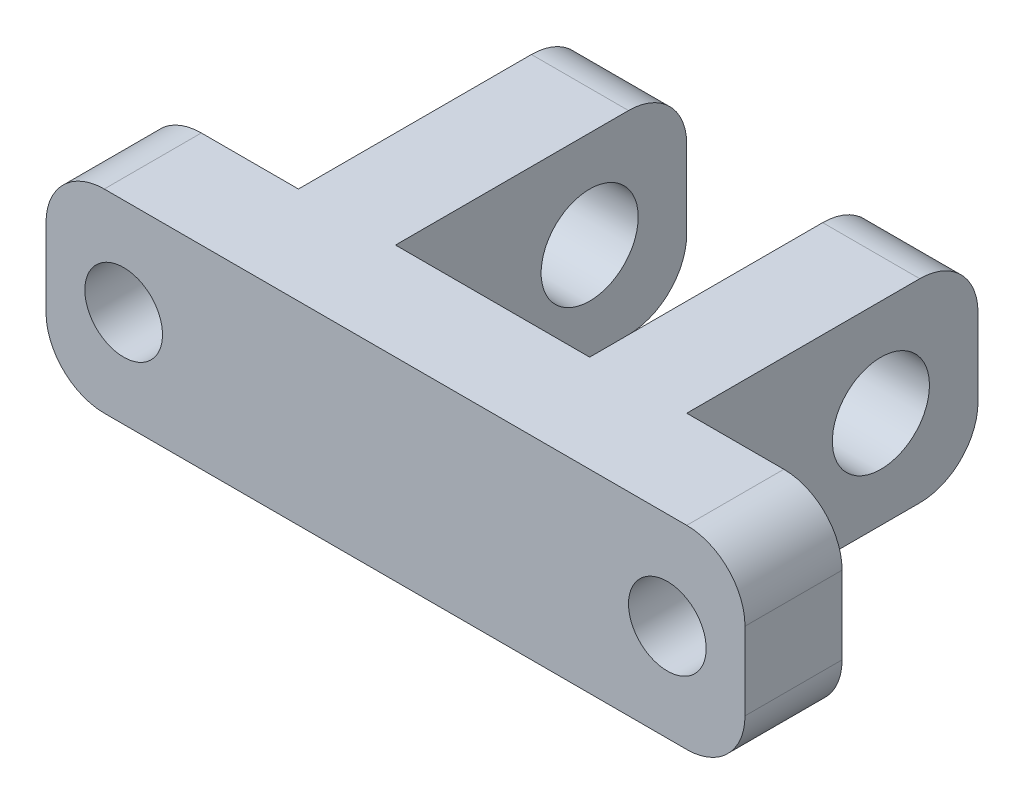
ISO-10303-21;
HEADER;
FILE_DESCRIPTION(('STEP AP214'),'2;1');
FILE_NAME('part.step','',(''),(''),'','','');
FILE_SCHEMA(('AUTOMOTIVE_DESIGN { 1 0 10303 214 1 1 1 1 }'));
ENDSEC;
DATA;
#1=APPLICATION_CONTEXT('core data for automotive mechanical design processes');
#2=APPLICATION_PROTOCOL_DEFINITION('international standard','automotive_design',2000,#1);
#3=PRODUCT_CONTEXT('',#1,'mechanical');
#4=PRODUCT('Part','Part','',(#3));
#5=PRODUCT_RELATED_PRODUCT_CATEGORY('part','',(#4));
#6=PRODUCT_DEFINITION_FORMATION('','',#4);
#7=PRODUCT_DEFINITION_CONTEXT('part definition',#1,'design');
#8=PRODUCT_DEFINITION('design','',#6,#7);
#9=PRODUCT_DEFINITION_SHAPE('','',#8);
#10=(LENGTH_UNIT() NAMED_UNIT(*) SI_UNIT(.MILLI.,.METRE.));
#11=(NAMED_UNIT(*) PLANE_ANGLE_UNIT() SI_UNIT($,.RADIAN.));
#12=(NAMED_UNIT(*) SI_UNIT($,.STERADIAN.) SOLID_ANGLE_UNIT());
#13=UNCERTAINTY_MEASURE_WITH_UNIT(LENGTH_MEASURE(1.E-05),#10,'distance_accuracy_value','');
#14=(GEOMETRIC_REPRESENTATION_CONTEXT(3) GLOBAL_UNCERTAINTY_ASSIGNED_CONTEXT((#13)) GLOBAL_UNIT_ASSIGNED_CONTEXT((#10,
#11,#12)) REPRESENTATION_CONTEXT('',''));
#15=CARTESIAN_POINT('',(0.,0.,0.));
#16=DIRECTION('',(0.,0.,1.));
#17=DIRECTION('',(1.,0.,0.));
#18=AXIS2_PLACEMENT_3D('',#15,#16,#17);
#19=CARTESIAN_POINT('',(18.,10.,-4.99999999999999));
#20=DIRECTION('',(0.,0.,1.));
#21=DIRECTION('',(1.,0.,0.));
#22=AXIS2_PLACEMENT_3D('',#19,#20,#21);
#23=PLANE('',#22);
#24=CARTESIAN_POINT('',(14.,5.,-4.99999999999999));
#25=DIRECTION('',(0.,0.,-1.));
#26=DIRECTION('',(-1.,0.,0.));
#27=AXIS2_PLACEMENT_3D('',#24,#25,#26);
#28=CIRCLE('',#27,2.);
#29=CARTESIAN_POINT('',(12.,5.,-4.99999999999999));
#30=VERTEX_POINT('',#29);
#31=EDGE_CURVE('E444',#30,#30,#28,.T.);
#32=ORIENTED_EDGE('',*,*,#31,.F.);
#33=EDGE_LOOP('',(#32));
#34=FACE_BOUND('',#33,.T.);
#35=DIRECTION('',(-1.,0.,0.));
#36=VECTOR('',#35,1.);
#37=CARTESIAN_POINT('',(18.,10.,-4.99999999999999));
#38=LINE('',#37,#36);
#39=CARTESIAN_POINT('',(15.,10.,-4.99999999999999));
#40=VERTEX_POINT('',#39);
#41=CARTESIAN_POINT('',(10.,10.,-4.99999999999999));
#42=VERTEX_POINT('',#41);
#43=EDGE_CURVE('E174',#40,#42,#38,.T.);
#44=ORIENTED_EDGE('',*,*,#43,.F.);
#45=CARTESIAN_POINT('',(15.,7.,-4.99999999999999));
#46=DIRECTION('',(0.,0.,1.));
#47=DIRECTION('',(1.,0.,0.));
#48=AXIS2_PLACEMENT_3D('',#45,#46,#47);
#49=CIRCLE('',#48,3.);
#50=CARTESIAN_POINT('',(18.,7.,-4.99999999999999));
#51=VERTEX_POINT('',#50);
#52=EDGE_CURVE('E59',#40,#51,#49,.F.);
#53=ORIENTED_EDGE('',*,*,#52,.T.);
#54=DIRECTION('',(0.,-1.,0.));
#55=VECTOR('',#54,1.);
#56=CARTESIAN_POINT('',(18.,10.,-4.99999999999999));
#57=LINE('',#56,#55);
#58=CARTESIAN_POINT('',(18.,3.,-4.99999999999999));
#59=VERTEX_POINT('',#58);
#60=EDGE_CURVE('E274',#51,#59,#57,.T.);
#61=ORIENTED_EDGE('',*,*,#60,.T.);
#62=CARTESIAN_POINT('',(15.,3.,-4.99999999999999));
#63=DIRECTION('',(0.,0.,1.));
#64=DIRECTION('',(1.,0.,0.));
#65=AXIS2_PLACEMENT_3D('',#62,#63,#64);
#66=CIRCLE('',#65,3.);
#67=CARTESIAN_POINT('',(15.,0.,-4.99999999999999));
#68=VERTEX_POINT('',#67);
#69=EDGE_CURVE('E51',#59,#68,#66,.F.);
#70=ORIENTED_EDGE('',*,*,#69,.T.);
#71=DIRECTION('',(-1.,0.,0.));
#72=VECTOR('',#71,1.);
#73=CARTESIAN_POINT('',(18.,0.,-4.99999999999999));
#74=LINE('',#73,#72);
#75=CARTESIAN_POINT('',(10.,0.,-4.99999999999999));
#76=VERTEX_POINT('',#75);
#77=EDGE_CURVE('E197',#68,#76,#74,.T.);
#78=ORIENTED_EDGE('',*,*,#77,.T.);
#79=DIRECTION('',(0.,-1.,0.));
#80=VECTOR('',#79,1.);
#81=CARTESIAN_POINT('',(10.,10.,-4.99999999999999));
#82=LINE('',#81,#80);
#83=EDGE_CURVE('E191',#42,#76,#82,.T.);
#84=ORIENTED_EDGE('',*,*,#83,.F.);
#85=EDGE_LOOP('',(#44,#53,#61,#70,#78,#84));
#86=FACE_BOUND('',#85,.T.);
#87=ADVANCED_FACE('F36',(#34,#86),#23,.F.);
#88=CARTESIAN_POINT('',(10.,10.,-4.99999999999999));
#89=DIRECTION('',(-1.,0.,0.));
#90=DIRECTION('',(0.,0.,1.));
#91=AXIS2_PLACEMENT_3D('',#88,#89,#90);
#92=PLANE('',#91);
#93=CARTESIAN_POINT('',(10.,5.,-15.));
#94=DIRECTION('',(1.,0.,0.));
#95=DIRECTION('',(0.,0.,-1.));
#96=AXIS2_PLACEMENT_3D('',#93,#94,#95);
#97=CIRCLE('',#96,2.5);
#98=CARTESIAN_POINT('',(9.99999999999999,5.,-17.5));
#99=VERTEX_POINT('',#98);
#100=EDGE_CURVE('E211',#99,#99,#97,.T.);
#101=ORIENTED_EDGE('',*,*,#100,.F.);
#102=EDGE_LOOP('',(#101));
#103=FACE_BOUND('',#102,.T.);
#104=DIRECTION('',(0.,-1.,0.));
#105=VECTOR('',#104,1.);
#106=CARTESIAN_POINT('',(10.,10.,-20.));
#107=LINE('',#106,#105);
#108=CARTESIAN_POINT('',(10.,7.,-20.));
#109=VERTEX_POINT('',#108);
#110=CARTESIAN_POINT('',(10.,3.,-20.));
#111=VERTEX_POINT('',#110);
#112=EDGE_CURVE('E199',#109,#111,#107,.T.);
#113=ORIENTED_EDGE('',*,*,#112,.F.);
#114=CARTESIAN_POINT('',(10.,7.,-17.));
#115=DIRECTION('',(-1.,0.,0.));
#116=DIRECTION('',(0.,0.,1.));
#117=AXIS2_PLACEMENT_3D('',#114,#115,#116);
#118=CIRCLE('',#117,3.);
#119=CARTESIAN_POINT('',(10.,10.,-17.));
#120=VERTEX_POINT('',#119);
#121=EDGE_CURVE('E193',#109,#120,#118,.F.);
#122=ORIENTED_EDGE('',*,*,#121,.T.);
#123=DIRECTION('',(0.,0.,-1.));
#124=VECTOR('',#123,1.);
#125=CARTESIAN_POINT('',(10.,10.,-4.99999999999999));
#126=LINE('',#125,#124);
#127=EDGE_CURVE('E178',#42,#120,#126,.T.);
#128=ORIENTED_EDGE('',*,*,#127,.F.);
#129=ORIENTED_EDGE('',*,*,#83,.T.);
#130=DIRECTION('',(0.,0.,-1.));
#131=VECTOR('',#130,1.);
#132=CARTESIAN_POINT('',(10.,0.,-4.99999999999999));
#133=LINE('',#132,#131);
#134=CARTESIAN_POINT('',(10.,0.,-17.));
#135=VERTEX_POINT('',#134);
#136=EDGE_CURVE('E333',#76,#135,#133,.T.);
#137=ORIENTED_EDGE('',*,*,#136,.T.);
#138=CARTESIAN_POINT('',(10.,3.,-17.));
#139=DIRECTION('',(-1.,0.,0.));
#140=DIRECTION('',(0.,0.,1.));
#141=AXIS2_PLACEMENT_3D('',#138,#139,#140);
#142=CIRCLE('',#141,3.);
#143=EDGE_CURVE('E229',#135,#111,#142,.F.);
#144=ORIENTED_EDGE('',*,*,#143,.T.);
#145=EDGE_LOOP('',(#113,#122,#128,#129,#137,#144));
#146=FACE_BOUND('',#145,.T.);
#147=ADVANCED_FACE('F189',(#103,#146),#92,.F.);
#148=CARTESIAN_POINT('',(10.,10.,-20.));
#149=DIRECTION('',(0.,0.,1.));
#150=DIRECTION('',(1.,0.,0.));
#151=AXIS2_PLACEMENT_3D('',#148,#149,#150);
#152=PLANE('',#151);
#153=DIRECTION('',(0.,-1.,0.));
#154=VECTOR('',#153,1.);
#155=CARTESIAN_POINT('',(5.,10.,-20.));
#156=LINE('',#155,#154);
#157=CARTESIAN_POINT('',(5.,7.,-20.));
#158=VERTEX_POINT('',#157);
#159=CARTESIAN_POINT('',(5.,3.,-20.));
#160=VERTEX_POINT('',#159);
#161=EDGE_CURVE('E204',#158,#160,#156,.T.);
#162=ORIENTED_EDGE('',*,*,#161,.F.);
#163=DIRECTION('',(-1.,0.,0.));
#164=VECTOR('',#163,1.);
#165=CARTESIAN_POINT('',(10.,7.,-20.));
#166=LINE('',#165,#164);
#167=EDGE_CURVE('E227',#158,#109,#166,.F.);
#168=ORIENTED_EDGE('',*,*,#167,.T.);
#169=ORIENTED_EDGE('',*,*,#112,.T.);
#170=DIRECTION('',(-1.,0.,0.));
#171=VECTOR('',#170,1.);
#172=CARTESIAN_POINT('',(5.,3.,-20.));
#173=LINE('',#172,#171);
#174=EDGE_CURVE('E224',#111,#160,#173,.T.);
#175=ORIENTED_EDGE('',*,*,#174,.T.);
#176=EDGE_LOOP('',(#162,#168,#169,#175));
#177=FACE_BOUND('',#176,.T.);
#178=ADVANCED_FACE('F315',(#177),#152,.F.);
#179=CARTESIAN_POINT('',(5.,10.,-20.));
#180=DIRECTION('',(1.,0.,0.));
#181=DIRECTION('',(0.,0.,-1.));
#182=AXIS2_PLACEMENT_3D('',#179,#180,#181);
#183=PLANE('',#182);
#184=CARTESIAN_POINT('',(5.,5.,-15.));
#185=DIRECTION('',(1.,0.,0.));
#186=DIRECTION('',(0.,0.,-1.));
#187=AXIS2_PLACEMENT_3D('',#184,#185,#186);
#188=CIRCLE('',#187,2.5);
#189=CARTESIAN_POINT('',(5.,5.,-17.5));
#190=VERTEX_POINT('',#189);
#191=EDGE_CURVE('E334',#190,#190,#188,.T.);
#192=ORIENTED_EDGE('',*,*,#191,.T.);
#193=EDGE_LOOP('',(#192));
#194=FACE_BOUND('',#193,.T.);
#195=DIRECTION('',(0.,0.,1.));
#196=VECTOR('',#195,1.);
#197=CARTESIAN_POINT('',(5.,10.,-20.));
#198=LINE('',#197,#196);
#199=CARTESIAN_POINT('',(5.,10.,-17.));
#200=VERTEX_POINT('',#199);
#201=CARTESIAN_POINT('',(5.,10.,-5.));
#202=VERTEX_POINT('',#201);
#203=EDGE_CURVE('E194',#200,#202,#198,.T.);
#204=ORIENTED_EDGE('',*,*,#203,.F.);
#205=CARTESIAN_POINT('',(5.,7.,-17.));
#206=DIRECTION('',(1.,0.,0.));
#207=DIRECTION('',(0.,0.,-1.));
#208=AXIS2_PLACEMENT_3D('',#205,#206,#207);
#209=CIRCLE('',#208,3.);
#210=EDGE_CURVE('E222',#200,#158,#209,.F.);
#211=ORIENTED_EDGE('',*,*,#210,.T.);
#212=ORIENTED_EDGE('',*,*,#161,.T.);
#213=CARTESIAN_POINT('',(5.,3.,-17.));
#214=DIRECTION('',(1.,0.,0.));
#215=DIRECTION('',(0.,0.,-1.));
#216=AXIS2_PLACEMENT_3D('',#213,#214,#215);
#217=CIRCLE('',#216,3.);
#218=CARTESIAN_POINT('',(5.,0.,-17.));
#219=VERTEX_POINT('',#218);
#220=EDGE_CURVE('E220',#160,#219,#217,.F.);
#221=ORIENTED_EDGE('',*,*,#220,.T.);
#222=DIRECTION('',(0.,0.,1.));
#223=VECTOR('',#222,1.);
#224=CARTESIAN_POINT('',(5.,0.,-20.));
#225=LINE('',#224,#223);
#226=CARTESIAN_POINT('',(5.,0.,-5.));
#227=VERTEX_POINT('',#226);
#228=EDGE_CURVE('E336',#219,#227,#225,.T.);
#229=ORIENTED_EDGE('',*,*,#228,.T.);
#230=DIRECTION('',(0.,-1.,0.));
#231=VECTOR('',#230,1.);
#232=CARTESIAN_POINT('',(5.,10.,-5.));
#233=LINE('',#232,#231);
#234=EDGE_CURVE('E305',#202,#227,#233,.T.);
#235=ORIENTED_EDGE('',*,*,#234,.F.);
#236=EDGE_LOOP('',(#204,#211,#212,#221,#229,#235));
#237=FACE_BOUND('',#236,.T.);
#238=ADVANCED_FACE('F311',(#194,#237),#183,.F.);
#239=CARTESIAN_POINT('',(5.,10.,-5.));
#240=DIRECTION('',(0.,0.,1.));
#241=DIRECTION('',(1.,0.,0.));
#242=AXIS2_PLACEMENT_3D('',#239,#240,#241);
#243=PLANE('',#242);
#244=DIRECTION('',(-1.,0.,0.));
#245=VECTOR('',#244,1.);
#246=CARTESIAN_POINT('',(5.,0.,-5.));
#247=LINE('',#246,#245);
#248=CARTESIAN_POINT('',(-5.,0.,-5.));
#249=VERTEX_POINT('',#248);
#250=EDGE_CURVE('E338',#227,#249,#247,.T.);
#251=ORIENTED_EDGE('',*,*,#250,.T.);
#252=DIRECTION('',(0.,-1.,0.));
#253=VECTOR('',#252,1.);
#254=CARTESIAN_POINT('',(-5.,10.,-5.));
#255=LINE('',#254,#253);
#256=CARTESIAN_POINT('',(-5.,10.,-5.));
#257=VERTEX_POINT('',#256);
#258=EDGE_CURVE('E302',#257,#249,#255,.T.);
#259=ORIENTED_EDGE('',*,*,#258,.F.);
#260=DIRECTION('',(-1.,0.,0.));
#261=VECTOR('',#260,1.);
#262=CARTESIAN_POINT('',(5.,10.,-5.));
#263=LINE('',#262,#261);
#264=EDGE_CURVE('E321',#202,#257,#263,.T.);
#265=ORIENTED_EDGE('',*,*,#264,.F.);
#266=ORIENTED_EDGE('',*,*,#234,.T.);
#267=EDGE_LOOP('',(#251,#259,#265,#266));
#268=FACE_BOUND('',#267,.T.);
#269=ADVANCED_FACE('F386',(#268),#243,.F.);
#270=CARTESIAN_POINT('',(-5.,10.,-5.));
#271=DIRECTION('',(-1.,0.,0.));
#272=DIRECTION('',(0.,0.,1.));
#273=AXIS2_PLACEMENT_3D('',#270,#271,#272);
#274=PLANE('',#273);
#275=CARTESIAN_POINT('',(-5.,5.,-15.));
#276=DIRECTION('',(-1.,0.,0.));
#277=DIRECTION('',(0.,0.,1.));
#278=AXIS2_PLACEMENT_3D('',#275,#276,#277);
#279=CIRCLE('',#278,2.5);
#280=CARTESIAN_POINT('',(-5.,5.,-17.5));
#281=VERTEX_POINT('',#280);
#282=EDGE_CURVE('E210',#281,#281,#279,.T.);
#283=ORIENTED_EDGE('',*,*,#282,.T.);
#284=EDGE_LOOP('',(#283));
#285=FACE_BOUND('',#284,.T.);
#286=DIRECTION('',(0.,0.,-1.));
#287=VECTOR('',#286,1.);
#288=CARTESIAN_POINT('',(-5.,0.,-5.));
#289=LINE('',#288,#287);
#290=CARTESIAN_POINT('',(-5.,0.,-17.));
#291=VERTEX_POINT('',#290);
#292=EDGE_CURVE('E340',#249,#291,#289,.T.);
#293=ORIENTED_EDGE('',*,*,#292,.T.);
#294=CARTESIAN_POINT('',(-5.,3.,-17.));
#295=DIRECTION('',(-1.,0.,0.));
#296=DIRECTION('',(0.,0.,1.));
#297=AXIS2_PLACEMENT_3D('',#294,#295,#296);
#298=CIRCLE('',#297,3.);
#299=CARTESIAN_POINT('',(-5.,3.,-20.));
#300=VERTEX_POINT('',#299);
#301=EDGE_CURVE('E251',#291,#300,#298,.F.);
#302=ORIENTED_EDGE('',*,*,#301,.T.);
#303=DIRECTION('',(0.,-1.,0.));
#304=VECTOR('',#303,1.);
#305=CARTESIAN_POINT('',(-5.,10.,-20.));
#306=LINE('',#305,#304);
#307=CARTESIAN_POINT('',(-5.,7.,-20.));
#308=VERTEX_POINT('',#307);
#309=EDGE_CURVE('E299',#308,#300,#306,.T.);
#310=ORIENTED_EDGE('',*,*,#309,.F.);
#311=CARTESIAN_POINT('',(-5.,7.,-17.));
#312=DIRECTION('',(-1.,0.,0.));
#313=DIRECTION('',(0.,0.,1.));
#314=AXIS2_PLACEMENT_3D('',#311,#312,#313);
#315=CIRCLE('',#314,3.);
#316=CARTESIAN_POINT('',(-5.,10.,-17.));
#317=VERTEX_POINT('',#316);
#318=EDGE_CURVE('E249',#308,#317,#315,.F.);
#319=ORIENTED_EDGE('',*,*,#318,.T.);
#320=DIRECTION('',(0.,0.,-1.));
#321=VECTOR('',#320,1.);
#322=CARTESIAN_POINT('',(-5.,10.,-5.));
#323=LINE('',#322,#321);
#324=EDGE_CURVE('E323',#257,#317,#323,.T.);
#325=ORIENTED_EDGE('',*,*,#324,.F.);
#326=ORIENTED_EDGE('',*,*,#258,.T.);
#327=EDGE_LOOP('',(#293,#302,#310,#319,#325,#326));
#328=FACE_BOUND('',#327,.T.);
#329=ADVANCED_FACE('F390',(#285,#328),#274,.F.);
#330=CARTESIAN_POINT('',(-5.,10.,-20.));
#331=DIRECTION('',(0.,0.,1.));
#332=DIRECTION('',(1.,0.,0.));
#333=AXIS2_PLACEMENT_3D('',#330,#331,#332);
#334=PLANE('',#333);
#335=ORIENTED_EDGE('',*,*,#309,.T.);
#336=DIRECTION('',(-1.,0.,0.));
#337=VECTOR('',#336,1.);
#338=CARTESIAN_POINT('',(-10.,3.,-20.));
#339=LINE('',#338,#337);
#340=CARTESIAN_POINT('',(-10.,3.,-20.));
#341=VERTEX_POINT('',#340);
#342=EDGE_CURVE('E242',#300,#341,#339,.T.);
#343=ORIENTED_EDGE('',*,*,#342,.T.);
#344=DIRECTION('',(0.,-1.,0.));
#345=VECTOR('',#344,1.);
#346=CARTESIAN_POINT('',(-10.,10.,-20.));
#347=LINE('',#346,#345);
#348=CARTESIAN_POINT('',(-10.,7.,-20.));
#349=VERTEX_POINT('',#348);
#350=EDGE_CURVE('E296',#349,#341,#347,.T.);
#351=ORIENTED_EDGE('',*,*,#350,.F.);
#352=DIRECTION('',(-1.,0.,0.));
#353=VECTOR('',#352,1.);
#354=CARTESIAN_POINT('',(-5.,7.,-20.));
#355=LINE('',#354,#353);
#356=EDGE_CURVE('E240',#349,#308,#355,.F.);
#357=ORIENTED_EDGE('',*,*,#356,.T.);
#358=EDGE_LOOP('',(#335,#343,#351,#357));
#359=FACE_BOUND('',#358,.T.);
#360=ADVANCED_FACE('F394',(#359),#334,.F.);
#361=CARTESIAN_POINT('',(-10.,10.,-20.));
#362=DIRECTION('',(1.,0.,0.));
#363=DIRECTION('',(0.,0.,-1.));
#364=AXIS2_PLACEMENT_3D('',#361,#362,#363);
#365=PLANE('',#364);
#366=CARTESIAN_POINT('',(-10.,5.,-15.));
#367=DIRECTION('',(1.,0.,0.));
#368=DIRECTION('',(0.,0.,-1.));
#369=AXIS2_PLACEMENT_3D('',#366,#367,#368);
#370=CIRCLE('',#369,2.5);
#371=CARTESIAN_POINT('',(-10.,5.,-17.5));
#372=VERTEX_POINT('',#371);
#373=EDGE_CURVE('E208',#372,#372,#370,.T.);
#374=ORIENTED_EDGE('',*,*,#373,.T.);
#375=EDGE_LOOP('',(#374));
#376=FACE_BOUND('',#375,.T.);
#377=ORIENTED_EDGE('',*,*,#350,.T.);
#378=CARTESIAN_POINT('',(-10.,3.,-17.));
#379=DIRECTION('',(1.,0.,0.));
#380=DIRECTION('',(0.,0.,-1.));
#381=AXIS2_PLACEMENT_3D('',#378,#379,#380);
#382=CIRCLE('',#381,3.);
#383=CARTESIAN_POINT('',(-10.,0.,-17.));
#384=VERTEX_POINT('',#383);
#385=EDGE_CURVE('E247',#341,#384,#382,.F.);
#386=ORIENTED_EDGE('',*,*,#385,.T.);
#387=DIRECTION('',(0.,0.,1.));
#388=VECTOR('',#387,1.);
#389=CARTESIAN_POINT('',(-10.,0.,-20.));
#390=LINE('',#389,#388);
#391=CARTESIAN_POINT('',(-10.,0.,-5.));
#392=VERTEX_POINT('',#391);
#393=EDGE_CURVE('E343',#384,#392,#390,.T.);
#394=ORIENTED_EDGE('',*,*,#393,.T.);
#395=DIRECTION('',(0.,-1.,0.));
#396=VECTOR('',#395,1.);
#397=CARTESIAN_POINT('',(-10.,10.,-5.));
#398=LINE('',#397,#396);
#399=CARTESIAN_POINT('',(-10.,10.,-5.));
#400=VERTEX_POINT('',#399);
#401=EDGE_CURVE('E293',#400,#392,#398,.T.);
#402=ORIENTED_EDGE('',*,*,#401,.F.);
#403=DIRECTION('',(0.,0.,1.));
#404=VECTOR('',#403,1.);
#405=CARTESIAN_POINT('',(-10.,10.,-20.));
#406=LINE('',#405,#404);
#407=CARTESIAN_POINT('',(-10.,10.,-17.));
#408=VERTEX_POINT('',#407);
#409=EDGE_CURVE('E328',#408,#400,#406,.T.);
#410=ORIENTED_EDGE('',*,*,#409,.F.);
#411=CARTESIAN_POINT('',(-10.,7.,-17.));
#412=DIRECTION('',(1.,0.,0.));
#413=DIRECTION('',(0.,0.,-1.));
#414=AXIS2_PLACEMENT_3D('',#411,#412,#413);
#415=CIRCLE('',#414,3.);
#416=EDGE_CURVE('E245',#408,#349,#415,.F.);
#417=ORIENTED_EDGE('',*,*,#416,.T.);
#418=EDGE_LOOP('',(#377,#386,#394,#402,#410,#417));
#419=FACE_BOUND('',#418,.T.);
#420=ADVANCED_FACE('F398',(#376,#419),#365,.F.);
#421=CARTESIAN_POINT('',(-10.,10.,-5.));
#422=DIRECTION('',(0.,0.,1.));
#423=DIRECTION('',(1.,0.,0.));
#424=AXIS2_PLACEMENT_3D('',#421,#422,#423);
#425=PLANE('',#424);
#426=CARTESIAN_POINT('',(-14.,5.,-5.));
#427=DIRECTION('',(0.,0.,-1.));
#428=DIRECTION('',(-1.,0.,0.));
#429=AXIS2_PLACEMENT_3D('',#426,#427,#428);
#430=CIRCLE('',#429,2.);
#431=CARTESIAN_POINT('',(-16.,5.,-5.));
#432=VERTEX_POINT('',#431);
#433=EDGE_CURVE('E439',#432,#432,#430,.T.);
#434=ORIENTED_EDGE('',*,*,#433,.F.);
#435=EDGE_LOOP('',(#434));
#436=FACE_BOUND('',#435,.T.);
#437=DIRECTION('',(-1.,0.,0.));
#438=VECTOR('',#437,1.);
#439=CARTESIAN_POINT('',(-10.,0.,-5.));
#440=LINE('',#439,#438);
#441=CARTESIAN_POINT('',(-15.,0.,-5.));
#442=VERTEX_POINT('',#441);
#443=EDGE_CURVE('E344',#392,#442,#440,.T.);
#444=ORIENTED_EDGE('',*,*,#443,.T.);
#445=CARTESIAN_POINT('',(-15.,3.,-5.));
#446=DIRECTION('',(0.,0.,1.));
#447=DIRECTION('',(1.,0.,0.));
#448=AXIS2_PLACEMENT_3D('',#445,#446,#447);
#449=CIRCLE('',#448,3.);
#450=CARTESIAN_POINT('',(-18.,3.,-5.));
#451=VERTEX_POINT('',#450);
#452=EDGE_CURVE('E268',#442,#451,#449,.F.);
#453=ORIENTED_EDGE('',*,*,#452,.T.);
#454=DIRECTION('',(0.,-1.,0.));
#455=VECTOR('',#454,1.);
#456=CARTESIAN_POINT('',(-18.,10.,-5.));
#457=LINE('',#456,#455);
#458=CARTESIAN_POINT('',(-18.,7.,-5.));
#459=VERTEX_POINT('',#458);
#460=EDGE_CURVE('E290',#459,#451,#457,.T.);
#461=ORIENTED_EDGE('',*,*,#460,.F.);
#462=CARTESIAN_POINT('',(-15.,7.,-5.));
#463=DIRECTION('',(0.,0.,1.));
#464=DIRECTION('',(1.,0.,0.));
#465=AXIS2_PLACEMENT_3D('',#462,#463,#464);
#466=CIRCLE('',#465,3.);
#467=CARTESIAN_POINT('',(-15.,10.,-5.));
#468=VERTEX_POINT('',#467);
#469=EDGE_CURVE('E266',#459,#468,#466,.F.);
#470=ORIENTED_EDGE('',*,*,#469,.T.);
#471=DIRECTION('',(-1.,0.,0.));
#472=VECTOR('',#471,1.);
#473=CARTESIAN_POINT('',(-10.,10.,-5.));
#474=LINE('',#473,#472);
#475=EDGE_CURVE('E283',#400,#468,#474,.T.);
#476=ORIENTED_EDGE('',*,*,#475,.F.);
#477=ORIENTED_EDGE('',*,*,#401,.T.);
#478=EDGE_LOOP('',(#444,#453,#461,#470,#476,#477));
#479=FACE_BOUND('',#478,.T.);
#480=ADVANCED_FACE('F402',(#436,#479),#425,.F.);
#481=CARTESIAN_POINT('',(-18.,10.,-5.));
#482=DIRECTION('',(1.,0.,0.));
#483=DIRECTION('',(0.,0.,-1.));
#484=AXIS2_PLACEMENT_3D('',#481,#482,#483);
#485=PLANE('',#484);
#486=ORIENTED_EDGE('',*,*,#460,.T.);
#487=DIRECTION('',(0.,0.,1.));
#488=VECTOR('',#487,1.);
#489=CARTESIAN_POINT('',(-18.,3.,0.));
#490=LINE('',#489,#488);
#491=CARTESIAN_POINT('',(-18.,3.,0.));
#492=VERTEX_POINT('',#491);
#493=EDGE_CURVE('E255',#451,#492,#490,.T.);
#494=ORIENTED_EDGE('',*,*,#493,.T.);
#495=DIRECTION('',(0.,-1.,0.));
#496=VECTOR('',#495,1.);
#497=CARTESIAN_POINT('',(-18.,10.,0.));
#498=LINE('',#497,#496);
#499=CARTESIAN_POINT('',(-18.,7.,0.));
#500=VERTEX_POINT('',#499);
#501=EDGE_CURVE('E281',#500,#492,#498,.T.);
#502=ORIENTED_EDGE('',*,*,#501,.F.);
#503=DIRECTION('',(0.,0.,1.));
#504=VECTOR('',#503,1.);
#505=CARTESIAN_POINT('',(-18.,7.,-5.));
#506=LINE('',#505,#504);
#507=EDGE_CURVE('E253',#500,#459,#506,.F.);
#508=ORIENTED_EDGE('',*,*,#507,.T.);
#509=EDGE_LOOP('',(#486,#494,#502,#508));
#510=FACE_BOUND('',#509,.T.);
#511=ADVANCED_FACE('F406',(#510),#485,.F.);
#512=CARTESIAN_POINT('',(-18.,10.,0.));
#513=DIRECTION('',(0.,0.,-1.));
#514=DIRECTION('',(-1.,0.,0.));
#515=AXIS2_PLACEMENT_3D('',#512,#513,#514);
#516=PLANE('',#515);
#517=CARTESIAN_POINT('',(-14.,5.,0.));
#518=DIRECTION('',(0.,0.,-1.));
#519=DIRECTION('',(-1.,0.,0.));
#520=AXIS2_PLACEMENT_3D('',#517,#518,#519);
#521=CIRCLE('',#520,2.);
#522=CARTESIAN_POINT('',(-16.,5.,0.));
#523=VERTEX_POINT('',#522);
#524=EDGE_CURVE('E436',#523,#523,#521,.T.);
#525=ORIENTED_EDGE('',*,*,#524,.T.);
#526=EDGE_LOOP('',(#525));
#527=FACE_BOUND('',#526,.T.);
#528=CARTESIAN_POINT('',(14.,5.,0.));
#529=DIRECTION('',(0.,0.,-1.));
#530=DIRECTION('',(-1.,0.,0.));
#531=AXIS2_PLACEMENT_3D('',#528,#529,#530);
#532=CIRCLE('',#531,2.);
#533=CARTESIAN_POINT('',(12.,5.,0.));
#534=VERTEX_POINT('',#533);
#535=EDGE_CURVE('E440',#534,#534,#532,.T.);
#536=ORIENTED_EDGE('',*,*,#535,.T.);
#537=EDGE_LOOP('',(#536));
#538=FACE_BOUND('',#537,.T.);
#539=ORIENTED_EDGE('',*,*,#501,.T.);
#540=CARTESIAN_POINT('',(-15.,3.,0.));
#541=DIRECTION('',(0.,0.,-1.));
#542=DIRECTION('',(-1.,0.,0.));
#543=AXIS2_PLACEMENT_3D('',#540,#541,#542);
#544=CIRCLE('',#543,3.);
#545=CARTESIAN_POINT('',(-15.,0.,0.));
#546=VERTEX_POINT('',#545);
#547=EDGE_CURVE('E264',#492,#546,#544,.F.);
#548=ORIENTED_EDGE('',*,*,#547,.T.);
#549=DIRECTION('',(1.,0.,0.));
#550=VECTOR('',#549,1.);
#551=CARTESIAN_POINT('',(-18.,0.,0.));
#552=LINE('',#551,#550);
#553=CARTESIAN_POINT('',(15.,0.,0.));
#554=VERTEX_POINT('',#553);
#555=EDGE_CURVE('E184',#546,#554,#552,.T.);
#556=ORIENTED_EDGE('',*,*,#555,.T.);
#557=CARTESIAN_POINT('',(15.,3.,0.));
#558=DIRECTION('',(0.,0.,-1.));
#559=DIRECTION('',(-1.,0.,0.));
#560=AXIS2_PLACEMENT_3D('',#557,#558,#559);
#561=CIRCLE('',#560,3.);
#562=CARTESIAN_POINT('',(18.,3.,0.));
#563=VERTEX_POINT('',#562);
#564=EDGE_CURVE('E258',#554,#563,#561,.F.);
#565=ORIENTED_EDGE('',*,*,#564,.T.);
#566=DIRECTION('',(0.,-1.,0.));
#567=VECTOR('',#566,1.);
#568=CARTESIAN_POINT('',(18.,10.,0.));
#569=LINE('',#568,#567);
#570=CARTESIAN_POINT('',(18.,7.,0.));
#571=VERTEX_POINT('',#570);
#572=EDGE_CURVE('E277',#571,#563,#569,.T.);
#573=ORIENTED_EDGE('',*,*,#572,.F.);
#574=CARTESIAN_POINT('',(15.,7.,0.));
#575=DIRECTION('',(0.,0.,-1.));
#576=DIRECTION('',(-1.,0.,0.));
#577=AXIS2_PLACEMENT_3D('',#574,#575,#576);
#578=CIRCLE('',#577,3.);
#579=CARTESIAN_POINT('',(15.,10.,0.));
#580=VERTEX_POINT('',#579);
#581=EDGE_CURVE('E260',#571,#580,#578,.F.);
#582=ORIENTED_EDGE('',*,*,#581,.T.);
#583=DIRECTION('',(1.,0.,0.));
#584=VECTOR('',#583,1.);
#585=CARTESIAN_POINT('',(-18.,10.,0.));
#586=LINE('',#585,#584);
#587=CARTESIAN_POINT('',(-15.,10.,0.));
#588=VERTEX_POINT('',#587);
#589=EDGE_CURVE('E279',#588,#580,#586,.T.);
#590=ORIENTED_EDGE('',*,*,#589,.F.);
#591=CARTESIAN_POINT('',(-15.,7.,0.));
#592=DIRECTION('',(0.,0.,-1.));
#593=DIRECTION('',(-1.,0.,0.));
#594=AXIS2_PLACEMENT_3D('',#591,#592,#593);
#595=CIRCLE('',#594,3.);
#596=EDGE_CURVE('E262',#588,#500,#595,.F.);
#597=ORIENTED_EDGE('',*,*,#596,.T.);
#598=EDGE_LOOP('',(#539,#548,#556,#565,#573,#582,#590,#597));
#599=FACE_BOUND('',#598,.T.);
#600=ADVANCED_FACE('F352',(#527,#538,#599),#516,.F.);
#601=CARTESIAN_POINT('',(18.,10.,0.));
#602=DIRECTION('',(-1.,0.,0.));
#603=DIRECTION('',(0.,0.,1.));
#604=AXIS2_PLACEMENT_3D('',#601,#602,#603);
#605=PLANE('',#604);
#606=ORIENTED_EDGE('',*,*,#60,.F.);
#607=DIRECTION('',(0.,0.,-1.));
#608=VECTOR('',#607,1.);
#609=CARTESIAN_POINT('',(18.,7.,0.));
#610=LINE('',#609,#608);
#611=EDGE_CURVE('E11',#51,#571,#610,.F.);
#612=ORIENTED_EDGE('',*,*,#611,.T.);
#613=ORIENTED_EDGE('',*,*,#572,.T.);
#614=DIRECTION('',(0.,0.,-1.));
#615=VECTOR('',#614,1.);
#616=CARTESIAN_POINT('',(18.,3.,-4.99999999999999));
#617=LINE('',#616,#615);
#618=EDGE_CURVE('E44',#563,#59,#617,.T.);
#619=ORIENTED_EDGE('',*,*,#618,.T.);
#620=EDGE_LOOP('',(#606,#612,#613,#619));
#621=FACE_BOUND('',#620,.T.);
#622=ADVANCED_FACE('F273',(#621),#605,.F.);
#623=CARTESIAN_POINT('',(0.,10.,0.));
#624=DIRECTION('',(0.,-1.,0.));
#625=DIRECTION('',(0.,0.,-1.));
#626=AXIS2_PLACEMENT_3D('',#623,#624,#625);
#627=PLANE('',#626);
#628=ORIENTED_EDGE('',*,*,#127,.T.);
#629=DIRECTION('',(-1.,0.,0.));
#630=VECTOR('',#629,1.);
#631=CARTESIAN_POINT('',(0.,10.,-17.));
#632=LINE('',#631,#630);
#633=EDGE_CURVE('E218',#120,#200,#632,.T.);
#634=ORIENTED_EDGE('',*,*,#633,.T.);
#635=ORIENTED_EDGE('',*,*,#203,.T.);
#636=ORIENTED_EDGE('',*,*,#264,.T.);
#637=ORIENTED_EDGE('',*,*,#324,.T.);
#638=DIRECTION('',(-1.,0.,0.));
#639=VECTOR('',#638,1.);
#640=CARTESIAN_POINT('',(0.,10.,-17.));
#641=LINE('',#640,#639);
#642=EDGE_CURVE('E215',#317,#408,#641,.T.);
#643=ORIENTED_EDGE('',*,*,#642,.T.);
#644=ORIENTED_EDGE('',*,*,#409,.T.);
#645=ORIENTED_EDGE('',*,*,#475,.T.);
#646=DIRECTION('',(0.,0.,1.));
#647=VECTOR('',#646,1.);
#648=CARTESIAN_POINT('',(-15.,10.,0.));
#649=LINE('',#648,#647);
#650=EDGE_CURVE('E201',#468,#588,#649,.T.);
#651=ORIENTED_EDGE('',*,*,#650,.T.);
#652=ORIENTED_EDGE('',*,*,#589,.T.);
#653=DIRECTION('',(0.,0.,-1.));
#654=VECTOR('',#653,1.);
#655=CARTESIAN_POINT('',(15.,10.,0.));
#656=LINE('',#655,#654);
#657=EDGE_CURVE('E182',#580,#40,#656,.T.);
#658=ORIENTED_EDGE('',*,*,#657,.T.);
#659=ORIENTED_EDGE('',*,*,#43,.T.);
#660=EDGE_LOOP('',(#628,#634,#635,#636,#637,#643,#644,#645,#651,#652,#658,#659));
#661=FACE_BOUND('',#660,.T.);
#662=ADVANCED_FACE('F176',(#661),#627,.F.);
#663=CARTESIAN_POINT('',(0.,0.,0.));
#664=DIRECTION('',(0.,-1.,0.));
#665=DIRECTION('',(0.,0.,-1.));
#666=AXIS2_PLACEMENT_3D('',#663,#664,#665);
#667=PLANE('',#666);
#668=ORIENTED_EDGE('',*,*,#228,.F.);
#669=DIRECTION('',(-1.,0.,0.));
#670=VECTOR('',#669,1.);
#671=CARTESIAN_POINT('',(9.99999999999999,0.,-17.));
#672=LINE('',#671,#670);
#673=EDGE_CURVE('E238',#219,#135,#672,.F.);
#674=ORIENTED_EDGE('',*,*,#673,.T.);
#675=ORIENTED_EDGE('',*,*,#136,.F.);
#676=ORIENTED_EDGE('',*,*,#77,.F.);
#677=DIRECTION('',(0.,0.,-1.));
#678=VECTOR('',#677,1.);
#679=CARTESIAN_POINT('',(15.,0.,0.));
#680=LINE('',#679,#678);
#681=EDGE_CURVE('E232',#68,#554,#680,.F.);
#682=ORIENTED_EDGE('',*,*,#681,.T.);
#683=ORIENTED_EDGE('',*,*,#555,.F.);
#684=DIRECTION('',(0.,0.,1.));
#685=VECTOR('',#684,1.);
#686=CARTESIAN_POINT('',(-15.,0.,-5.));
#687=LINE('',#686,#685);
#688=EDGE_CURVE('E234',#546,#442,#687,.F.);
#689=ORIENTED_EDGE('',*,*,#688,.T.);
#690=ORIENTED_EDGE('',*,*,#443,.F.);
#691=ORIENTED_EDGE('',*,*,#393,.F.);
#692=DIRECTION('',(-1.,0.,0.));
#693=VECTOR('',#692,1.);
#694=CARTESIAN_POINT('',(-5.,0.,-17.));
#695=LINE('',#694,#693);
#696=EDGE_CURVE('E236',#384,#291,#695,.F.);
#697=ORIENTED_EDGE('',*,*,#696,.T.);
#698=ORIENTED_EDGE('',*,*,#292,.F.);
#699=ORIENTED_EDGE('',*,*,#250,.F.);
#700=EDGE_LOOP('',(#668,#674,#675,#676,#682,#683,#689,#690,#691,#697,#698,#699));
#701=FACE_BOUND('',#700,.T.);
#702=ADVANCED_FACE('F355',(#701),#667,.T.);
#703=CARTESIAN_POINT('',(-18.,5.,-15.));
#704=DIRECTION('',(1.,0.,0.));
#705=DIRECTION('',(0.,0.,-1.));
#706=AXIS2_PLACEMENT_3D('',#703,#704,#705);
#707=CYLINDRICAL_SURFACE('',#706,2.5);
#708=CARTESIAN_POINT('',(-10.,5.,-17.5));
#709=CARTESIAN_POINT('',(-9.94791666666667,5.,-17.5));
#710=CARTESIAN_POINT('',(-9.89583333333333,5.,-17.5));
#711=CARTESIAN_POINT('',(-9.79166666666667,5.,-17.5));
#712=CARTESIAN_POINT('',(-9.73958333333333,5.,-17.5));
#713=CARTESIAN_POINT('',(-9.63541666666667,5.,-17.5));
#714=CARTESIAN_POINT('',(-9.58333333333333,5.,-17.5));
#715=CARTESIAN_POINT('',(-9.47916666666667,5.,-17.5));
#716=CARTESIAN_POINT('',(-9.42708333333333,5.,-17.5));
#717=CARTESIAN_POINT('',(-9.32291666666667,5.,-17.5));
#718=CARTESIAN_POINT('',(-9.27083333333333,5.,-17.5));
#719=CARTESIAN_POINT('',(-9.16666666666667,5.,-17.5));
#720=CARTESIAN_POINT('',(-9.11458333333333,5.,-17.5));
#721=CARTESIAN_POINT('',(-9.01041666666667,5.,-17.5));
#722=CARTESIAN_POINT('',(-8.95833333333333,5.,-17.5));
#723=CARTESIAN_POINT('',(-8.85416666666667,5.,-17.5));
#724=CARTESIAN_POINT('',(-8.80208333333333,5.,-17.5));
#725=CARTESIAN_POINT('',(-8.69791666666667,5.,-17.5));
#726=CARTESIAN_POINT('',(-8.64583333333333,5.,-17.5));
#727=CARTESIAN_POINT('',(-8.54166666666667,5.,-17.5));
#728=CARTESIAN_POINT('',(-8.48958333333333,5.,-17.5));
#729=CARTESIAN_POINT('',(-8.38541666666667,5.,-17.5));
#730=CARTESIAN_POINT('',(-8.33333333333333,5.,-17.5));
#731=CARTESIAN_POINT('',(-8.22916666666667,5.,-17.5));
#732=CARTESIAN_POINT('',(-8.17708333333333,5.,-17.5));
#733=CARTESIAN_POINT('',(-8.07291666666667,5.,-17.5));
#734=CARTESIAN_POINT('',(-8.02083333333333,5.,-17.5));
#735=CARTESIAN_POINT('',(-7.91666666666667,5.,-17.5));
#736=CARTESIAN_POINT('',(-7.86458333333333,5.,-17.5));
#737=CARTESIAN_POINT('',(-7.76041666666667,5.,-17.5));
#738=CARTESIAN_POINT('',(-7.70833333333333,5.,-17.5));
#739=CARTESIAN_POINT('',(-7.60416666666667,5.,-17.5));
#740=CARTESIAN_POINT('',(-7.55208333333333,5.,-17.5));
#741=CARTESIAN_POINT('',(-7.44791666666667,5.,-17.5));
#742=CARTESIAN_POINT('',(-7.39583333333333,5.,-17.5));
#743=CARTESIAN_POINT('',(-7.29166666666667,5.,-17.5));
#744=CARTESIAN_POINT('',(-7.23958333333333,5.,-17.5));
#745=CARTESIAN_POINT('',(-7.13541666666667,5.,-17.5));
#746=CARTESIAN_POINT('',(-7.08333333333333,5.,-17.5));
#747=CARTESIAN_POINT('',(-6.97916666666667,5.,-17.5));
#748=CARTESIAN_POINT('',(-6.92708333333333,5.,-17.5));
#749=CARTESIAN_POINT('',(-6.82291666666667,5.,-17.5));
#750=CARTESIAN_POINT('',(-6.77083333333333,5.,-17.5));
#751=CARTESIAN_POINT('',(-6.66666666666667,5.,-17.5));
#752=CARTESIAN_POINT('',(-6.61458333333333,5.,-17.5));
#753=CARTESIAN_POINT('',(-6.51041666666667,5.,-17.5));
#754=CARTESIAN_POINT('',(-6.45833333333333,5.,-17.5));
#755=CARTESIAN_POINT('',(-6.35416666666667,5.,-17.5));
#756=CARTESIAN_POINT('',(-6.30208333333333,5.,-17.5));
#757=CARTESIAN_POINT('',(-6.19791666666667,5.,-17.5));
#758=CARTESIAN_POINT('',(-6.14583333333333,5.,-17.5));
#759=CARTESIAN_POINT('',(-6.04166666666667,5.,-17.5));
#760=CARTESIAN_POINT('',(-5.98958333333333,5.,-17.5));
#761=CARTESIAN_POINT('',(-5.88541666666667,5.,-17.5));
#762=CARTESIAN_POINT('',(-5.83333333333333,5.,-17.5));
#763=CARTESIAN_POINT('',(-5.72916666666667,5.,-17.5));
#764=CARTESIAN_POINT('',(-5.67708333333333,5.,-17.5));
#765=CARTESIAN_POINT('',(-5.57291666666667,5.,-17.5));
#766=CARTESIAN_POINT('',(-5.52083333333333,5.,-17.5));
#767=CARTESIAN_POINT('',(-5.41666666666667,5.,-17.5));
#768=CARTESIAN_POINT('',(-5.36458333333333,5.,-17.5));
#769=CARTESIAN_POINT('',(-5.26041666666667,5.,-17.5));
#770=CARTESIAN_POINT('',(-5.20833333333333,5.,-17.5));
#771=CARTESIAN_POINT('',(-5.10416666666667,5.,-17.5));
#772=CARTESIAN_POINT('',(-5.05208333333333,5.,-17.5));
#773=CARTESIAN_POINT('',(-5.,5.,-17.5));
#774=B_SPLINE_CURVE_WITH_KNOTS('',3,(#708,#709,#710,#711,#712,#713,#714,#715,#716,#717,#718,
#719,#720,#721,#722,#723,#724,#725,#726,#727,#728,#729,#730,#731,#732,#733,#734,#735,#736,#737,
#738,#739,#740,#741,#742,#743,#744,#745,#746,#747,#748,#749,#750,#751,#752,#753,#754,#755,#756,
#757,#758,#759,#760,#761,#762,#763,#764,#765,#766,#767,#768,#769,#770,#771,#772,#773),
.UNSPECIFIED.,.F.,.F.,(4,2,2,2,2,2,2,2,2,2,2,2,2,2,2,2,2,2,2,2,2,2,2,2,2,2,2,2,2,2,2,2,4),(0.,
0.15625,0.3125,0.46875,0.625000000000001,0.781250000000001,0.937500000000001,1.09375,1.25,
1.40625,1.5625,1.71875,1.875,2.03125,2.1875,2.34375,2.5,2.65625,2.8125,2.96875,3.125,3.28125,
3.4375,3.59375,3.75,3.90625,4.0625,4.21875,4.375,4.53125,4.6875,4.84375,5.),.UNSPECIFIED.);
#775=EDGE_CURVE('BSEAM418',#372,#281,#774,.T.);
#776=ORIENTED_EDGE('',*,*,#373,.F.);
#777=ORIENTED_EDGE('',*,*,#282,.F.);
#778=ORIENTED_EDGE('',*,*,#775,.T.);
#779=ORIENTED_EDGE('',*,*,#775,.F.);
#780=EDGE_LOOP('',(#776,#778,#777,#779));
#781=FACE_BOUND('',#780,.T.);
#782=ADVANCED_FACE('F418',(#781),#707,.F.);
#783=CARTESIAN_POINT('',(9.99999999999999,5.,-17.5));
#784=CARTESIAN_POINT('',(9.94791666666666,5.,-17.5));
#785=CARTESIAN_POINT('',(9.89583333333333,5.,-17.5));
#786=CARTESIAN_POINT('',(9.79166666666666,5.,-17.5));
#787=CARTESIAN_POINT('',(9.73958333333333,5.,-17.5));
#788=CARTESIAN_POINT('',(9.63541666666666,5.,-17.5));
#789=CARTESIAN_POINT('',(9.58333333333333,5.,-17.5));
#790=CARTESIAN_POINT('',(9.47916666666666,5.,-17.5));
#791=CARTESIAN_POINT('',(9.42708333333333,5.,-17.5));
#792=CARTESIAN_POINT('',(9.32291666666666,5.,-17.5));
#793=CARTESIAN_POINT('',(9.27083333333333,5.,-17.5));
#794=CARTESIAN_POINT('',(9.16666666666666,5.,-17.5));
#795=CARTESIAN_POINT('',(9.11458333333333,5.,-17.5));
#796=CARTESIAN_POINT('',(9.01041666666666,5.,-17.5));
#797=CARTESIAN_POINT('',(8.95833333333333,5.,-17.5));
#798=CARTESIAN_POINT('',(8.85416666666666,5.,-17.5));
#799=CARTESIAN_POINT('',(8.80208333333333,5.,-17.5));
#800=CARTESIAN_POINT('',(8.69791666666666,5.,-17.5));
#801=CARTESIAN_POINT('',(8.64583333333333,5.,-17.5));
#802=CARTESIAN_POINT('',(8.54166666666666,5.,-17.5));
#803=CARTESIAN_POINT('',(8.48958333333333,5.,-17.5));
#804=CARTESIAN_POINT('',(8.38541666666666,5.,-17.5));
#805=CARTESIAN_POINT('',(8.33333333333333,5.,-17.5));
#806=CARTESIAN_POINT('',(8.22916666666666,5.,-17.5));
#807=CARTESIAN_POINT('',(8.17708333333333,5.,-17.5));
#808=CARTESIAN_POINT('',(8.07291666666667,5.,-17.5));
#809=CARTESIAN_POINT('',(8.02083333333333,5.,-17.5));
#810=CARTESIAN_POINT('',(7.91666666666667,5.,-17.5));
#811=CARTESIAN_POINT('',(7.86458333333333,5.,-17.5));
#812=CARTESIAN_POINT('',(7.76041666666667,5.,-17.5));
#813=CARTESIAN_POINT('',(7.70833333333333,5.,-17.5));
#814=CARTESIAN_POINT('',(7.60416666666667,5.,-17.5));
#815=CARTESIAN_POINT('',(7.55208333333333,5.,-17.5));
#816=CARTESIAN_POINT('',(7.44791666666667,5.,-17.5));
#817=CARTESIAN_POINT('',(7.39583333333333,5.,-17.5));
#818=CARTESIAN_POINT('',(7.29166666666667,5.,-17.5));
#819=CARTESIAN_POINT('',(7.23958333333333,5.,-17.5));
#820=CARTESIAN_POINT('',(7.13541666666667,5.,-17.5));
#821=CARTESIAN_POINT('',(7.08333333333333,5.,-17.5));
#822=CARTESIAN_POINT('',(6.97916666666667,5.,-17.5));
#823=CARTESIAN_POINT('',(6.92708333333333,5.,-17.5));
#824=CARTESIAN_POINT('',(6.82291666666667,5.,-17.5));
#825=CARTESIAN_POINT('',(6.77083333333333,5.,-17.5));
#826=CARTESIAN_POINT('',(6.66666666666667,5.,-17.5));
#827=CARTESIAN_POINT('',(6.61458333333334,5.,-17.5));
#828=CARTESIAN_POINT('',(6.51041666666667,5.,-17.5));
#829=CARTESIAN_POINT('',(6.45833333333334,5.,-17.5));
#830=CARTESIAN_POINT('',(6.35416666666667,5.,-17.5));
#831=CARTESIAN_POINT('',(6.30208333333334,5.,-17.5));
#832=CARTESIAN_POINT('',(6.19791666666667,5.,-17.5));
#833=CARTESIAN_POINT('',(6.14583333333334,5.,-17.5));
#834=CARTESIAN_POINT('',(6.04166666666667,5.,-17.5));
#835=CARTESIAN_POINT('',(5.98958333333334,5.,-17.5));
#836=CARTESIAN_POINT('',(5.88541666666667,5.,-17.5));
#837=CARTESIAN_POINT('',(5.83333333333334,5.,-17.5));
#838=CARTESIAN_POINT('',(5.72916666666667,5.,-17.5));
#839=CARTESIAN_POINT('',(5.67708333333334,5.,-17.5));
#840=CARTESIAN_POINT('',(5.57291666666667,5.,-17.5));
#841=CARTESIAN_POINT('',(5.52083333333334,5.,-17.5));
#842=CARTESIAN_POINT('',(5.41666666666667,5.,-17.5));
#843=CARTESIAN_POINT('',(5.36458333333334,5.,-17.5));
#844=CARTESIAN_POINT('',(5.26041666666667,5.,-17.5));
#845=CARTESIAN_POINT('',(5.20833333333334,5.,-17.5));
#846=CARTESIAN_POINT('',(5.10416666666667,5.,-17.5));
#847=CARTESIAN_POINT('',(5.05208333333334,5.,-17.5));
#848=CARTESIAN_POINT('',(5.,5.,-17.5));
#849=B_SPLINE_CURVE_WITH_KNOTS('',3,(#783,#784,#785,#786,#787,#788,#789,#790,#791,#792,#793,
#794,#795,#796,#797,#798,#799,#800,#801,#802,#803,#804,#805,#806,#807,#808,#809,#810,#811,#812,
#813,#814,#815,#816,#817,#818,#819,#820,#821,#822,#823,#824,#825,#826,#827,#828,#829,#830,#831,
#832,#833,#834,#835,#836,#837,#838,#839,#840,#841,#842,#843,#844,#845,#846,#847,#848),
.UNSPECIFIED.,.F.,.F.,(4,2,2,2,2,2,2,2,2,2,2,2,2,2,2,2,2,2,2,2,2,2,2,2,2,2,2,2,2,2,2,2,4),(0.,
0.15625,0.3125,0.46875,0.625000000000001,0.781249999999997,0.937499999999997,1.09375,1.25,
1.40625,1.5625,1.71875,1.87499999999999,2.03124999999999,2.1875,2.34375,2.5,2.65625,2.8125,
2.96875,3.125,3.28124999999999,3.43749999999999,3.59374999999999,3.74999999999999,
3.90624999999999,4.06249999999999,4.21874999999999,4.37499999999999,4.53124999999999,
4.68749999999999,4.84374999999999,4.99999999999999),.UNSPECIFIED.);
#850=EDGE_CURVE('BSEAM370',#99,#190,#849,.T.);
#851=ORIENTED_EDGE('',*,*,#100,.T.);
#852=ORIENTED_EDGE('',*,*,#191,.F.);
#853=ORIENTED_EDGE('',*,*,#850,.T.);
#854=ORIENTED_EDGE('',*,*,#850,.F.);
#855=EDGE_LOOP('',(#851,#853,#852,#854));
#856=FACE_BOUND('',#855,.T.);
#857=ADVANCED_FACE('F370',(#856),#707,.F.);
#858=CARTESIAN_POINT('',(0.,7.,-17.));
#859=DIRECTION('',(-1.,0.,0.));
#860=DIRECTION('',(0.,0.,1.));
#861=AXIS2_PLACEMENT_3D('',#858,#859,#860);
#862=CYLINDRICAL_SURFACE('',#861,3.);
#863=ORIENTED_EDGE('',*,*,#121,.F.);
#864=ORIENTED_EDGE('',*,*,#167,.F.);
#865=ORIENTED_EDGE('',*,*,#210,.F.);
#866=ORIENTED_EDGE('',*,*,#633,.F.);
#867=EDGE_LOOP('',(#863,#864,#865,#866));
#868=FACE_BOUND('',#867,.T.);
#869=ADVANCED_FACE('F318',(#868),#862,.T.);
#870=CARTESIAN_POINT('',(9.99999999999999,3.,-17.));
#871=DIRECTION('',(1.,0.,0.));
#872=DIRECTION('',(0.,0.,-1.));
#873=AXIS2_PLACEMENT_3D('',#870,#871,#872);
#874=CYLINDRICAL_SURFACE('',#873,3.);
#875=ORIENTED_EDGE('',*,*,#143,.F.);
#876=ORIENTED_EDGE('',*,*,#673,.F.);
#877=ORIENTED_EDGE('',*,*,#220,.F.);
#878=ORIENTED_EDGE('',*,*,#174,.F.);
#879=EDGE_LOOP('',(#875,#876,#877,#878));
#880=FACE_BOUND('',#879,.T.);
#881=ADVANCED_FACE('F359',(#880),#874,.T.);
#882=CARTESIAN_POINT('',(-5.,3.,-17.));
#883=DIRECTION('',(1.,0.,0.));
#884=DIRECTION('',(0.,0.,-1.));
#885=AXIS2_PLACEMENT_3D('',#882,#883,#884);
#886=CYLINDRICAL_SURFACE('',#885,3.);
#887=ORIENTED_EDGE('',*,*,#301,.F.);
#888=ORIENTED_EDGE('',*,*,#696,.F.);
#889=ORIENTED_EDGE('',*,*,#385,.F.);
#890=ORIENTED_EDGE('',*,*,#342,.F.);
#891=EDGE_LOOP('',(#887,#888,#889,#890));
#892=FACE_BOUND('',#891,.T.);
#893=ADVANCED_FACE('F361',(#892),#886,.T.);
#894=CARTESIAN_POINT('',(0.,7.,-17.));
#895=DIRECTION('',(-1.,0.,0.));
#896=DIRECTION('',(0.,0.,1.));
#897=AXIS2_PLACEMENT_3D('',#894,#895,#896);
#898=CYLINDRICAL_SURFACE('',#897,3.);
#899=ORIENTED_EDGE('',*,*,#318,.F.);
#900=ORIENTED_EDGE('',*,*,#356,.F.);
#901=ORIENTED_EDGE('',*,*,#416,.F.);
#902=ORIENTED_EDGE('',*,*,#642,.F.);
#903=EDGE_LOOP('',(#899,#900,#901,#902));
#904=FACE_BOUND('',#903,.T.);
#905=ADVANCED_FACE('F367',(#904),#898,.T.);
#906=CARTESIAN_POINT('',(-15.,3.,-5.));
#907=DIRECTION('',(0.,0.,-1.));
#908=DIRECTION('',(-1.,0.,0.));
#909=AXIS2_PLACEMENT_3D('',#906,#907,#908);
#910=CYLINDRICAL_SURFACE('',#909,3.);
#911=ORIENTED_EDGE('',*,*,#452,.F.);
#912=ORIENTED_EDGE('',*,*,#688,.F.);
#913=ORIENTED_EDGE('',*,*,#547,.F.);
#914=ORIENTED_EDGE('',*,*,#493,.F.);
#915=EDGE_LOOP('',(#911,#912,#913,#914));
#916=FACE_BOUND('',#915,.T.);
#917=ADVANCED_FACE('F492',(#916),#910,.T.);
#918=CARTESIAN_POINT('',(-15.,7.,0.));
#919=DIRECTION('',(0.,0.,1.));
#920=DIRECTION('',(1.,0.,0.));
#921=AXIS2_PLACEMENT_3D('',#918,#919,#920);
#922=CYLINDRICAL_SURFACE('',#921,3.);
#923=ORIENTED_EDGE('',*,*,#469,.F.);
#924=ORIENTED_EDGE('',*,*,#507,.F.);
#925=ORIENTED_EDGE('',*,*,#596,.F.);
#926=ORIENTED_EDGE('',*,*,#650,.F.);
#927=EDGE_LOOP('',(#923,#924,#925,#926));
#928=FACE_BOUND('',#927,.T.);
#929=ADVANCED_FACE('F487',(#928),#922,.T.);
#930=CARTESIAN_POINT('',(15.,7.,0.));
#931=DIRECTION('',(0.,0.,-1.));
#932=DIRECTION('',(-1.,0.,0.));
#933=AXIS2_PLACEMENT_3D('',#930,#931,#932);
#934=CYLINDRICAL_SURFACE('',#933,3.);
#935=ORIENTED_EDGE('',*,*,#581,.F.);
#936=ORIENTED_EDGE('',*,*,#611,.F.);
#937=ORIENTED_EDGE('',*,*,#52,.F.);
#938=ORIENTED_EDGE('',*,*,#657,.F.);
#939=EDGE_LOOP('',(#935,#936,#937,#938));
#940=FACE_BOUND('',#939,.T.);
#941=ADVANCED_FACE('F499',(#940),#934,.T.);
#942=CARTESIAN_POINT('',(15.,3.,0.));
#943=DIRECTION('',(0.,0.,1.));
#944=DIRECTION('',(1.,0.,0.));
#945=AXIS2_PLACEMENT_3D('',#942,#943,#944);
#946=CYLINDRICAL_SURFACE('',#945,3.);
#947=ORIENTED_EDGE('',*,*,#564,.F.);
#948=ORIENTED_EDGE('',*,*,#681,.F.);
#949=ORIENTED_EDGE('',*,*,#69,.F.);
#950=ORIENTED_EDGE('',*,*,#618,.F.);
#951=EDGE_LOOP('',(#947,#948,#949,#950));
#952=FACE_BOUND('',#951,.T.);
#953=ADVANCED_FACE('F38',(#952),#946,.T.);
#954=CARTESIAN_POINT('',(14.,5.,0.));
#955=DIRECTION('',(0.,0.,-1.));
#956=DIRECTION('',(-1.,0.,0.));
#957=AXIS2_PLACEMENT_3D('',#954,#955,#956);
#958=CYLINDRICAL_SURFACE('',#957,2.);
#959=ORIENTED_EDGE('',*,*,#535,.F.);
#960=EDGE_LOOP('',(#959));
#961=FACE_BOUND('',#960,.T.);
#962=ORIENTED_EDGE('',*,*,#31,.T.);
#963=EDGE_LOOP('',(#962));
#964=FACE_BOUND('',#963,.T.);
#965=ADVANCED_FACE('F424',(#961,#964),#958,.F.);
#966=CARTESIAN_POINT('',(-14.,5.,0.));
#967=DIRECTION('',(0.,0.,-1.));
#968=DIRECTION('',(-1.,0.,0.));
#969=AXIS2_PLACEMENT_3D('',#966,#967,#968);
#970=CYLINDRICAL_SURFACE('',#969,2.);
#971=ORIENTED_EDGE('',*,*,#524,.F.);
#972=EDGE_LOOP('',(#971));
#973=FACE_BOUND('',#972,.T.);
#974=ORIENTED_EDGE('',*,*,#433,.T.);
#975=EDGE_LOOP('',(#974));
#976=FACE_BOUND('',#975,.T.);
#977=ADVANCED_FACE('F427',(#973,#976),#970,.F.);
#978=CLOSED_SHELL('',(#87,#147,#178,#238,#269,#329,#360,#420,#480,#511,#600,#622,#662,#702,#782,
#857,#869,#881,#893,#905,#917,#929,#941,#953,#965,#977));
#979=MANIFOLD_SOLID_BREP('B2',#978);
#980=ADVANCED_BREP_SHAPE_REPRESENTATION('',(#18,#979),#14);
#981=SHAPE_DEFINITION_REPRESENTATION(#9,#980);
ENDSEC;
END-ISO-10303-21;
